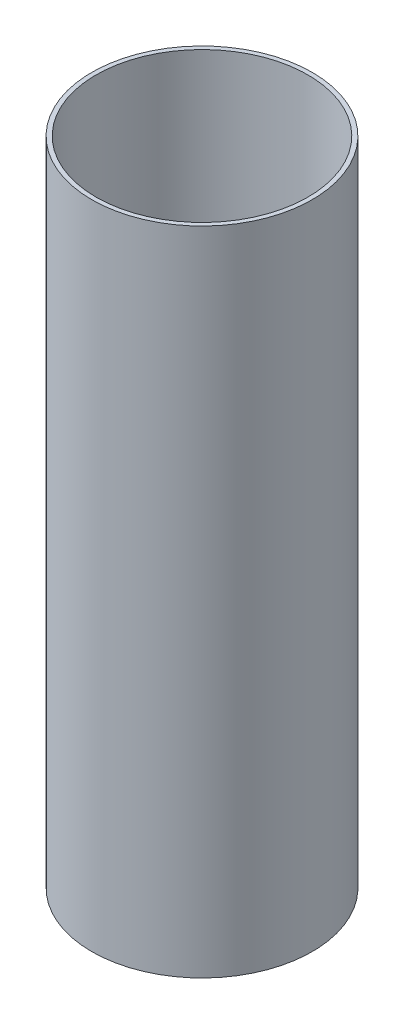
ISO-10303-21;
HEADER;
FILE_DESCRIPTION(('STEP AP214'),'2;1');
FILE_NAME('part.step','',(''),(''),'','','');
FILE_SCHEMA(('AUTOMOTIVE_DESIGN { 1 0 10303 214 1 1 1 1 }'));
ENDSEC;
DATA;
#1=APPLICATION_CONTEXT('core data for automotive mechanical design processes');
#2=APPLICATION_PROTOCOL_DEFINITION('international standard','automotive_design',2000,#1);
#3=PRODUCT_CONTEXT('',#1,'mechanical');
#4=PRODUCT('Part','Part','',(#3));
#5=PRODUCT_RELATED_PRODUCT_CATEGORY('part','',(#4));
#6=PRODUCT_DEFINITION_FORMATION('','',#4);
#7=PRODUCT_DEFINITION_CONTEXT('part definition',#1,'design');
#8=PRODUCT_DEFINITION('design','',#6,#7);
#9=PRODUCT_DEFINITION_SHAPE('','',#8);
#10=(LENGTH_UNIT() NAMED_UNIT(*) SI_UNIT(.MILLI.,.METRE.));
#11=(NAMED_UNIT(*) PLANE_ANGLE_UNIT() SI_UNIT($,.RADIAN.));
#12=(NAMED_UNIT(*) SI_UNIT($,.STERADIAN.) SOLID_ANGLE_UNIT());
#13=UNCERTAINTY_MEASURE_WITH_UNIT(LENGTH_MEASURE(1.E-05),#10,'distance_accuracy_value','');
#14=(GEOMETRIC_REPRESENTATION_CONTEXT(3) GLOBAL_UNCERTAINTY_ASSIGNED_CONTEXT((#13)) GLOBAL_UNIT_ASSIGNED_CONTEXT((#10,
#11,#12)) REPRESENTATION_CONTEXT('',''));
#15=CARTESIAN_POINT('',(0.,0.,0.));
#16=DIRECTION('',(0.,0.,1.));
#17=DIRECTION('',(1.,0.,0.));
#18=AXIS2_PLACEMENT_3D('',#15,#16,#17);
#19=CARTESIAN_POINT('',(0.,150.,0.));
#20=DIRECTION('',(0.,1.,0.));
#21=DIRECTION('',(0.,0.,1.));
#22=AXIS2_PLACEMENT_3D('',#19,#20,#21);
#23=PLANE('',#22);
#24=CARTESIAN_POINT('',(0.,150.,0.));
#25=DIRECTION('',(0.,1.,0.));
#26=DIRECTION('',(0.,0.,1.));
#27=AXIS2_PLACEMENT_3D('',#24,#25,#26);
#28=CIRCLE('',#27,25.4);
#29=CARTESIAN_POINT('',(0.,150.,25.4));
#30=VERTEX_POINT('',#29);
#31=EDGE_CURVE('E10',#30,#30,#28,.T.);
#32=ORIENTED_EDGE('',*,*,#31,.T.);
#33=EDGE_LOOP('',(#32));
#34=FACE_BOUND('',#33,.T.);
#35=CARTESIAN_POINT('',(0.,150.,0.));
#36=DIRECTION('',(0.,1.,0.));
#37=DIRECTION('',(0.,0.,1.));
#38=AXIS2_PLACEMENT_3D('',#35,#36,#37);
#39=CIRCLE('',#38,24.4);
#40=CARTESIAN_POINT('',(0.,150.,24.4));
#41=VERTEX_POINT('',#40);
#42=EDGE_CURVE('E46',#41,#41,#39,.T.);
#43=ORIENTED_EDGE('',*,*,#42,.F.);
#44=EDGE_LOOP('',(#43));
#45=FACE_BOUND('',#44,.T.);
#46=ADVANCED_FACE('F35',(#34,#45),#23,.T.);
#47=CARTESIAN_POINT('',(0.,0.,0.));
#48=DIRECTION('',(0.,1.,0.));
#49=DIRECTION('',(0.,0.,1.));
#50=AXIS2_PLACEMENT_3D('',#47,#48,#49);
#51=PLANE('',#50);
#52=CARTESIAN_POINT('',(0.,0.,0.));
#53=DIRECTION('',(0.,1.,0.));
#54=DIRECTION('',(0.,0.,1.));
#55=AXIS2_PLACEMENT_3D('',#52,#53,#54);
#56=CIRCLE('',#55,25.4);
#57=CARTESIAN_POINT('',(0.,0.,25.4));
#58=VERTEX_POINT('',#57);
#59=EDGE_CURVE('E39',#58,#58,#56,.T.);
#60=ORIENTED_EDGE('',*,*,#59,.F.);
#61=EDGE_LOOP('',(#60));
#62=FACE_BOUND('',#61,.T.);
#63=CARTESIAN_POINT('',(0.,0.,0.));
#64=DIRECTION('',(0.,1.,0.));
#65=DIRECTION('',(0.,0.,1.));
#66=AXIS2_PLACEMENT_3D('',#63,#64,#65);
#67=CIRCLE('',#66,24.4);
#68=CARTESIAN_POINT('',(0.,0.,24.4));
#69=VERTEX_POINT('',#68);
#70=EDGE_CURVE('E48',#69,#69,#67,.T.);
#71=ORIENTED_EDGE('',*,*,#70,.T.);
#72=EDGE_LOOP('',(#71));
#73=FACE_BOUND('',#72,.T.);
#74=ADVANCED_FACE('F58',(#62,#73),#51,.F.);
#75=CARTESIAN_POINT('',(0.,150.,0.));
#76=DIRECTION('',(0.,-1.,0.));
#77=DIRECTION('',(0.,0.,-1.));
#78=AXIS2_PLACEMENT_3D('',#75,#76,#77);
#79=CYLINDRICAL_SURFACE('',#78,25.4);
#80=ORIENTED_EDGE('',*,*,#31,.F.);
#81=EDGE_LOOP('',(#80));
#82=FACE_BOUND('',#81,.T.);
#83=ORIENTED_EDGE('',*,*,#59,.T.);
#84=EDGE_LOOP('',(#83));
#85=FACE_BOUND('',#84,.T.);
#86=ADVANCED_FACE('F37',(#82,#85),#79,.T.);
#87=CARTESIAN_POINT('',(0.,150.,0.));
#88=DIRECTION('',(0.,-1.,0.));
#89=DIRECTION('',(0.,0.,-1.));
#90=AXIS2_PLACEMENT_3D('',#87,#88,#89);
#91=CYLINDRICAL_SURFACE('',#90,24.4);
#92=ORIENTED_EDGE('',*,*,#42,.T.);
#93=EDGE_LOOP('',(#92));
#94=FACE_BOUND('',#93,.T.);
#95=ORIENTED_EDGE('',*,*,#70,.F.);
#96=EDGE_LOOP('',(#95));
#97=FACE_BOUND('',#96,.T.);
#98=ADVANCED_FACE('F54',(#94,#97),#91,.F.);
#99=CLOSED_SHELL('',(#46,#74,#86,#98));
#100=MANIFOLD_SOLID_BREP('B2',#99);
#101=ADVANCED_BREP_SHAPE_REPRESENTATION('',(#18,#100),#14);
#102=SHAPE_DEFINITION_REPRESENTATION(#9,#101);
ENDSEC;
END-ISO-10303-21;
